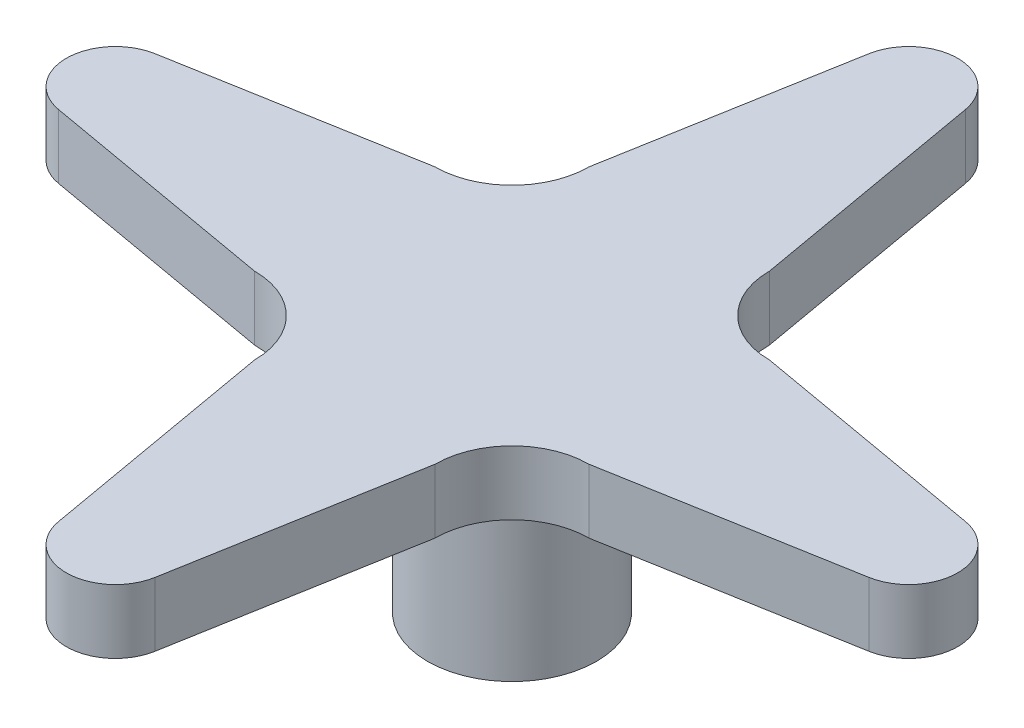
ISO-10303-21;
HEADER;
FILE_DESCRIPTION(('STEP AP214'),'2;1');
FILE_NAME('part.step','',(''),(''),'','','');
FILE_SCHEMA(('AUTOMOTIVE_DESIGN { 1 0 10303 214 1 1 1 1 }'));
ENDSEC;
DATA;
#1=APPLICATION_CONTEXT('core data for automotive mechanical design processes');
#2=APPLICATION_PROTOCOL_DEFINITION('international standard','automotive_design',2000,#1);
#3=PRODUCT_CONTEXT('',#1,'mechanical');
#4=PRODUCT('Part','Part','',(#3));
#5=PRODUCT_RELATED_PRODUCT_CATEGORY('part','',(#4));
#6=PRODUCT_DEFINITION_FORMATION('','',#4);
#7=PRODUCT_DEFINITION_CONTEXT('part definition',#1,'design');
#8=PRODUCT_DEFINITION('design','',#6,#7);
#9=PRODUCT_DEFINITION_SHAPE('','',#8);
#10=(LENGTH_UNIT() NAMED_UNIT(*) SI_UNIT(.MILLI.,.METRE.));
#11=(NAMED_UNIT(*) PLANE_ANGLE_UNIT() SI_UNIT($,.RADIAN.));
#12=(NAMED_UNIT(*) SI_UNIT($,.STERADIAN.) SOLID_ANGLE_UNIT());
#13=UNCERTAINTY_MEASURE_WITH_UNIT(LENGTH_MEASURE(1.E-05),#10,'distance_accuracy_value','');
#14=(GEOMETRIC_REPRESENTATION_CONTEXT(3) GLOBAL_UNCERTAINTY_ASSIGNED_CONTEXT((#13)) GLOBAL_UNIT_ASSIGNED_CONTEXT((#10,
#11,#12)) REPRESENTATION_CONTEXT('',''));
#15=CARTESIAN_POINT('',(0.,0.,0.));
#16=DIRECTION('',(0.,0.,1.));
#17=DIRECTION('',(1.,0.,0.));
#18=AXIS2_PLACEMENT_3D('',#15,#16,#17);
#19=CARTESIAN_POINT('',(0.,1.325,-16.4191467762285));
#20=DIRECTION('',(0.,-1.,0.));
#21=DIRECTION('',(0.,0.,-1.));
#22=AXIS2_PLACEMENT_3D('',#19,#20,#21);
#23=CYLINDRICAL_SURFACE('',#22,2.03085322377149);
#24=CARTESIAN_POINT('',(0.,-1.325,-16.4191467762285));
#25=DIRECTION('',(0.,1.,0.));
#26=DIRECTION('',(0.,0.,1.));
#27=AXIS2_PLACEMENT_3D('',#24,#25,#26);
#28=CIRCLE('',#27,2.03085322377149);
#29=CARTESIAN_POINT('',(2.,-1.325,-16.7718007376454));
#30=VERTEX_POINT('',#29);
#31=CARTESIAN_POINT('',(-2.,-1.325,-16.7718007376454));
#32=VERTEX_POINT('',#31);
#33=EDGE_CURVE('E194',#30,#32,#28,.T.);
#34=ORIENTED_EDGE('',*,*,#33,.T.);
#35=DIRECTION('',(0.,-1.,0.));
#36=VECTOR('',#35,1.);
#37=CARTESIAN_POINT('',(-2.,1.325,-16.7718007376454));
#38=LINE('',#37,#36);
#39=CARTESIAN_POINT('',(-2.,1.325,-16.7718007376454));
#40=VERTEX_POINT('',#39);
#41=EDGE_CURVE('E44',#40,#32,#38,.T.);
#42=ORIENTED_EDGE('',*,*,#41,.F.);
#43=CARTESIAN_POINT('',(0.,1.325,-16.4191467762285));
#44=DIRECTION('',(0.,1.,0.));
#45=DIRECTION('',(0.,0.,1.));
#46=AXIS2_PLACEMENT_3D('',#43,#44,#45);
#47=CIRCLE('',#46,2.03085322377149);
#48=CARTESIAN_POINT('',(2.,1.325,-16.7718007376454));
#49=VERTEX_POINT('',#48);
#50=EDGE_CURVE('E229',#49,#40,#47,.T.);
#51=ORIENTED_EDGE('',*,*,#50,.F.);
#52=DIRECTION('',(0.,-1.,0.));
#53=VECTOR('',#52,1.);
#54=CARTESIAN_POINT('',(2.,1.325,-16.7718007376454));
#55=LINE('',#54,#53);
#56=EDGE_CURVE('E190',#49,#30,#55,.T.);
#57=ORIENTED_EDGE('',*,*,#56,.T.);
#58=EDGE_LOOP('',(#34,#42,#51,#57));
#59=FACE_BOUND('',#58,.T.);
#60=ADVANCED_FACE('F37',(#59),#23,.T.);
#61=CARTESIAN_POINT('',(-2.,1.325,-16.7718007376454));
#62=DIRECTION('',(0.984807753012209,0.,0.173648177666924));
#63=DIRECTION('',(0.173648177666924,0.,-0.984807753012209));
#64=AXIS2_PLACEMENT_3D('',#61,#62,#63);
#65=PLANE('',#64);
#66=DIRECTION('',(-0.173648177666924,0.,0.984807753012209));
#67=VECTOR('',#66,1.);
#68=CARTESIAN_POINT('',(-2.,-1.325,-16.7718007376454));
#69=LINE('',#68,#67);
#70=CARTESIAN_POINT('',(-3.73648177666924,-1.325,-6.92372320752332));
#71=VERTEX_POINT('',#70);
#72=EDGE_CURVE('E197',#32,#71,#69,.T.);
#73=ORIENTED_EDGE('',*,*,#72,.T.);
#74=DIRECTION('',(0.,-1.,0.));
#75=VECTOR('',#74,1.);
#76=CARTESIAN_POINT('',(-3.73648177666924,1.325,-6.92372320752332));
#77=LINE('',#76,#75);
#78=CARTESIAN_POINT('',(-3.73648177666924,1.325,-6.92372320752332));
#79=VERTEX_POINT('',#78);
#80=EDGE_CURVE('E263',#79,#71,#77,.T.);
#81=ORIENTED_EDGE('',*,*,#80,.F.);
#82=DIRECTION('',(-0.173648177666924,0.,0.984807753012209));
#83=VECTOR('',#82,1.);
#84=CARTESIAN_POINT('',(-2.,1.325,-16.7718007376454));
#85=LINE('',#84,#83);
#86=EDGE_CURVE('E126',#40,#79,#85,.T.);
#87=ORIENTED_EDGE('',*,*,#86,.F.);
#88=ORIENTED_EDGE('',*,*,#41,.T.);
#89=EDGE_LOOP('',(#73,#81,#87,#88));
#90=FACE_BOUND('',#89,.T.);
#91=ADVANCED_FACE('F266',(#90),#65,.F.);
#92=CARTESIAN_POINT('',(-6.92372320752326,1.325,-6.9237232075234));
#93=DIRECTION('',(0.,-1.,0.));
#94=DIRECTION('',(0.,0.,-1.));
#95=AXIS2_PLACEMENT_3D('',#92,#93,#94);
#96=CYLINDRICAL_SURFACE('',#95,3.18724143085409);
#97=CARTESIAN_POINT('',(-6.92372320752326,-1.325,-6.9237232075234));
#98=DIRECTION('',(0.,-1.,0.));
#99=DIRECTION('',(0.,0.,1.));
#100=AXIS2_PLACEMENT_3D('',#97,#98,#99);
#101=CIRCLE('',#100,3.18724143085409);
#102=CARTESIAN_POINT('',(-6.92372320752328,-1.325,-3.73648177666931));
#103=VERTEX_POINT('',#102);
#104=EDGE_CURVE('E201',#71,#103,#101,.T.);
#105=ORIENTED_EDGE('',*,*,#104,.T.);
#106=DIRECTION('',(0.,-1.,0.));
#107=VECTOR('',#106,1.);
#108=CARTESIAN_POINT('',(-6.92372320752328,1.325,-3.73648177666931));
#109=LINE('',#108,#107);
#110=CARTESIAN_POINT('',(-6.92372320752328,1.325,-3.73648177666931));
#111=VERTEX_POINT('',#110);
#112=EDGE_CURVE('E260',#111,#103,#109,.T.);
#113=ORIENTED_EDGE('',*,*,#112,.F.);
#114=CARTESIAN_POINT('',(-6.92372320752333,1.325,-6.92372320752334));
#115=DIRECTION('',(0.,-1.,0.));
#116=DIRECTION('',(0.,0.,-1.));
#117=AXIS2_PLACEMENT_3D('',#114,#115,#116);
#118=CIRCLE('',#117,3.18724143085409);
#119=EDGE_CURVE('E285',#79,#111,#118,.T.);
#120=ORIENTED_EDGE('',*,*,#119,.F.);
#121=ORIENTED_EDGE('',*,*,#80,.T.);
#122=EDGE_LOOP('',(#105,#113,#120,#121));
#123=FACE_BOUND('',#122,.T.);
#124=ADVANCED_FACE('F276',(#123),#96,.F.);
#125=CARTESIAN_POINT('',(-16.7718007376454,1.325,-2.00000000000017));
#126=DIRECTION('',(0.173648177666913,0.,0.984807753012211));
#127=DIRECTION('',(0.984807753012211,0.,-0.173648177666913));
#128=AXIS2_PLACEMENT_3D('',#125,#126,#127);
#129=PLANE('',#128);
#130=DIRECTION('',(-0.984807753012211,0.,0.173648177666913));
#131=VECTOR('',#130,1.);
#132=CARTESIAN_POINT('',(-16.7718007376454,-1.325,-2.00000000000017));
#133=LINE('',#132,#131);
#134=CARTESIAN_POINT('',(-16.7718007376454,-1.325,-2.00000000000018));
#135=VERTEX_POINT('',#134);
#136=EDGE_CURVE('E203',#103,#135,#133,.T.);
#137=ORIENTED_EDGE('',*,*,#136,.T.);
#138=DIRECTION('',(0.,-1.,0.));
#139=VECTOR('',#138,1.);
#140=CARTESIAN_POINT('',(-16.7718007376454,1.325,-2.00000000000018));
#141=LINE('',#140,#139);
#142=CARTESIAN_POINT('',(-16.7718007376454,1.325,-2.00000000000018));
#143=VERTEX_POINT('',#142);
#144=EDGE_CURVE('E257',#143,#135,#141,.T.);
#145=ORIENTED_EDGE('',*,*,#144,.F.);
#146=DIRECTION('',(-0.984807753012211,0.,0.173648177666913));
#147=VECTOR('',#146,1.);
#148=CARTESIAN_POINT('',(-16.7718007376454,1.325,-2.00000000000017));
#149=LINE('',#148,#147);
#150=EDGE_CURVE('E282',#111,#143,#149,.T.);
#151=ORIENTED_EDGE('',*,*,#150,.F.);
#152=ORIENTED_EDGE('',*,*,#112,.T.);
#153=EDGE_LOOP('',(#137,#145,#151,#152));
#154=FACE_BOUND('',#153,.T.);
#155=ADVANCED_FACE('F280',(#154),#129,.F.);
#156=CARTESIAN_POINT('',(-16.4191467762285,1.325,-1.71294574661319E-13));
#157=DIRECTION('',(0.,-1.,0.));
#158=DIRECTION('',(0.,0.,-1.));
#159=AXIS2_PLACEMENT_3D('',#156,#157,#158);
#160=CYLINDRICAL_SURFACE('',#159,2.03085322377149);
#161=CARTESIAN_POINT('',(-16.4191467762285,-1.325,-1.71294574661319E-13));
#162=DIRECTION('',(0.,1.,0.));
#163=DIRECTION('',(0.,0.,1.));
#164=AXIS2_PLACEMENT_3D('',#161,#162,#163);
#165=CIRCLE('',#164,2.03085322377149);
#166=CARTESIAN_POINT('',(-16.7718007376454,-1.325,1.99999999999983));
#167=VERTEX_POINT('',#166);
#168=EDGE_CURVE('E205',#135,#167,#165,.T.);
#169=ORIENTED_EDGE('',*,*,#168,.T.);
#170=DIRECTION('',(0.,-1.,0.));
#171=VECTOR('',#170,1.);
#172=CARTESIAN_POINT('',(-16.7718007376454,1.325,1.99999999999983));
#173=LINE('',#172,#171);
#174=CARTESIAN_POINT('',(-16.7718007376454,1.325,1.99999999999983));
#175=VERTEX_POINT('',#174);
#176=EDGE_CURVE('E254',#175,#167,#173,.T.);
#177=ORIENTED_EDGE('',*,*,#176,.F.);
#178=CARTESIAN_POINT('',(-16.4191467762285,1.325,-1.71294574661319E-13));
#179=DIRECTION('',(0.,1.,0.));
#180=DIRECTION('',(0.,0.,1.));
#181=AXIS2_PLACEMENT_3D('',#178,#179,#180);
#182=CIRCLE('',#181,2.03085322377149);
#183=EDGE_CURVE('E284',#143,#175,#182,.T.);
#184=ORIENTED_EDGE('',*,*,#183,.F.);
#185=ORIENTED_EDGE('',*,*,#144,.T.);
#186=EDGE_LOOP('',(#169,#177,#184,#185));
#187=FACE_BOUND('',#186,.T.);
#188=ADVANCED_FACE('F369',(#187),#160,.T.);
#189=CARTESIAN_POINT('',(-16.7718007376454,1.325,1.99999999999983));
#190=DIRECTION('',(0.173648177666934,0.,-0.984807753012207));
#191=DIRECTION('',(-0.984807753012207,0.,-0.173648177666934));
#192=AXIS2_PLACEMENT_3D('',#189,#190,#191);
#193=PLANE('',#192);
#194=DIRECTION('',(0.984807753012207,0.,0.173648177666934));
#195=VECTOR('',#194,1.);
#196=CARTESIAN_POINT('',(-16.7718007376454,-1.325,1.99999999999983));
#197=LINE('',#196,#195);
#198=CARTESIAN_POINT('',(-6.92372320752336,-1.325,3.73648177666916));
#199=VERTEX_POINT('',#198);
#200=EDGE_CURVE('E207',#167,#199,#197,.T.);
#201=ORIENTED_EDGE('',*,*,#200,.T.);
#202=DIRECTION('',(0.,-1.,0.));
#203=VECTOR('',#202,1.);
#204=CARTESIAN_POINT('',(-6.92372320752336,1.325,3.73648177666916));
#205=LINE('',#204,#203);
#206=CARTESIAN_POINT('',(-6.92372320752336,1.325,3.73648177666916));
#207=VERTEX_POINT('',#206);
#208=EDGE_CURVE('E251',#207,#199,#205,.T.);
#209=ORIENTED_EDGE('',*,*,#208,.F.);
#210=DIRECTION('',(0.984807753012207,0.,0.173648177666934));
#211=VECTOR('',#210,1.);
#212=CARTESIAN_POINT('',(-16.7718007376454,1.325,1.99999999999983));
#213=LINE('',#212,#211);
#214=EDGE_CURVE('E287',#175,#207,#213,.T.);
#215=ORIENTED_EDGE('',*,*,#214,.F.);
#216=ORIENTED_EDGE('',*,*,#176,.T.);
#217=EDGE_LOOP('',(#201,#209,#215,#216));
#218=FACE_BOUND('',#217,.T.);
#219=ADVANCED_FACE('F372',(#218),#193,.F.);
#220=CARTESIAN_POINT('',(-6.92372320752338,1.325,6.92372320752329));
#221=DIRECTION('',(0.,-1.,0.));
#222=DIRECTION('',(0.,0.,-1.));
#223=AXIS2_PLACEMENT_3D('',#220,#221,#222);
#224=CYLINDRICAL_SURFACE('',#223,3.18724143085409);
#225=CARTESIAN_POINT('',(-6.92372320752338,-1.325,6.92372320752329));
#226=DIRECTION('',(0.,-1.,0.));
#227=DIRECTION('',(0.,0.,1.));
#228=AXIS2_PLACEMENT_3D('',#225,#226,#227);
#229=CIRCLE('',#228,3.18724143085409);
#230=CARTESIAN_POINT('',(-3.73648177666928,-1.325,6.9237232075233));
#231=VERTEX_POINT('',#230);
#232=EDGE_CURVE('E210',#199,#231,#229,.T.);
#233=ORIENTED_EDGE('',*,*,#232,.T.);
#234=DIRECTION('',(0.,-1.,0.));
#235=VECTOR('',#234,1.);
#236=CARTESIAN_POINT('',(-3.73648177666928,1.325,6.9237232075233));
#237=LINE('',#236,#235);
#238=CARTESIAN_POINT('',(-3.73648177666928,1.325,6.9237232075233));
#239=VERTEX_POINT('',#238);
#240=EDGE_CURVE('E248',#239,#231,#237,.T.);
#241=ORIENTED_EDGE('',*,*,#240,.F.);
#242=CARTESIAN_POINT('',(-6.92372320752341,1.325,6.92372320752325));
#243=DIRECTION('',(0.,-1.,0.));
#244=DIRECTION('',(0.,0.,-1.));
#245=AXIS2_PLACEMENT_3D('',#242,#243,#244);
#246=CIRCLE('',#245,3.18724143085409);
#247=EDGE_CURVE('E293',#207,#239,#246,.T.);
#248=ORIENTED_EDGE('',*,*,#247,.F.);
#249=ORIENTED_EDGE('',*,*,#208,.T.);
#250=EDGE_LOOP('',(#233,#241,#248,#249));
#251=FACE_BOUND('',#250,.T.);
#252=ADVANCED_FACE('F376',(#251),#224,.F.);
#253=CARTESIAN_POINT('',(-2.00000000000012,1.325,16.7718007376454));
#254=DIRECTION('',(0.98480775301221,0.,-0.173648177666917));
#255=DIRECTION('',(-0.173648177666917,0.,-0.98480775301221));
#256=AXIS2_PLACEMENT_3D('',#253,#254,#255);
#257=PLANE('',#256);
#258=DIRECTION('',(0.173648177666917,0.,0.98480775301221));
#259=VECTOR('',#258,1.);
#260=CARTESIAN_POINT('',(-2.00000000000012,-1.325,16.7718007376454));
#261=LINE('',#260,#259);
#262=CARTESIAN_POINT('',(-2.00000000000012,-1.325,16.7718007376454));
#263=VERTEX_POINT('',#262);
#264=EDGE_CURVE('E212',#231,#263,#261,.T.);
#265=ORIENTED_EDGE('',*,*,#264,.T.);
#266=DIRECTION('',(0.,-1.,0.));
#267=VECTOR('',#266,1.);
#268=CARTESIAN_POINT('',(-2.00000000000012,1.325,16.7718007376454));
#269=LINE('',#268,#267);
#270=CARTESIAN_POINT('',(-2.00000000000012,1.325,16.7718007376454));
#271=VERTEX_POINT('',#270);
#272=EDGE_CURVE('E245',#271,#263,#269,.T.);
#273=ORIENTED_EDGE('',*,*,#272,.F.);
#274=DIRECTION('',(0.173648177666917,0.,0.98480775301221));
#275=VECTOR('',#274,1.);
#276=CARTESIAN_POINT('',(-2.00000000000012,1.325,16.7718007376454));
#277=LINE('',#276,#275);
#278=EDGE_CURVE('E295',#239,#271,#277,.T.);
#279=ORIENTED_EDGE('',*,*,#278,.F.);
#280=ORIENTED_EDGE('',*,*,#240,.T.);
#281=EDGE_LOOP('',(#265,#273,#279,#280));
#282=FACE_BOUND('',#281,.T.);
#283=ADVANCED_FACE('F380',(#282),#257,.F.);
#284=CARTESIAN_POINT('',(-1.14654289137856E-13,1.325,16.4191467762285));
#285=DIRECTION('',(0.,-1.,0.));
#286=DIRECTION('',(0.,0.,-1.));
#287=AXIS2_PLACEMENT_3D('',#284,#285,#286);
#288=CYLINDRICAL_SURFACE('',#287,2.03085322377149);
#289=CARTESIAN_POINT('',(-1.14654289137856E-13,-1.325,16.4191467762285));
#290=DIRECTION('',(0.,1.,0.));
#291=DIRECTION('',(0.,0.,1.));
#292=AXIS2_PLACEMENT_3D('',#289,#290,#291);
#293=CIRCLE('',#292,2.03085322377149);
#294=CARTESIAN_POINT('',(1.99999999999988,-1.325,16.7718007376454));
#295=VERTEX_POINT('',#294);
#296=EDGE_CURVE('E214',#263,#295,#293,.T.);
#297=ORIENTED_EDGE('',*,*,#296,.T.);
#298=DIRECTION('',(0.,-1.,0.));
#299=VECTOR('',#298,1.);
#300=CARTESIAN_POINT('',(1.99999999999988,1.325,16.7718007376454));
#301=LINE('',#300,#299);
#302=CARTESIAN_POINT('',(1.99999999999988,1.325,16.7718007376454));
#303=VERTEX_POINT('',#302);
#304=EDGE_CURVE('E242',#303,#295,#301,.T.);
#305=ORIENTED_EDGE('',*,*,#304,.F.);
#306=CARTESIAN_POINT('',(-1.14654289137856E-13,1.325,16.4191467762285));
#307=DIRECTION('',(0.,1.,0.));
#308=DIRECTION('',(0.,0.,1.));
#309=AXIS2_PLACEMENT_3D('',#306,#307,#308);
#310=CIRCLE('',#309,2.03085322377149);
#311=EDGE_CURVE('E297',#271,#303,#310,.T.);
#312=ORIENTED_EDGE('',*,*,#311,.F.);
#313=ORIENTED_EDGE('',*,*,#272,.T.);
#314=EDGE_LOOP('',(#297,#305,#312,#313));
#315=FACE_BOUND('',#314,.T.);
#316=ADVANCED_FACE('F384',(#315),#288,.T.);
#317=CARTESIAN_POINT('',(1.99999999999988,1.325,16.7718007376454));
#318=DIRECTION('',(-0.984807753012208,0.,-0.173648177666931));
#319=DIRECTION('',(-0.173648177666931,0.,0.984807753012208));
#320=AXIS2_PLACEMENT_3D('',#317,#318,#319);
#321=PLANE('',#320);
#322=DIRECTION('',(0.173648177666931,0.,-0.984807753012208));
#323=VECTOR('',#322,1.);
#324=CARTESIAN_POINT('',(1.99999999999988,-1.325,16.7718007376454));
#325=LINE('',#324,#323);
#326=CARTESIAN_POINT('',(3.73648177666919,-1.325,6.92372320752335));
#327=VERTEX_POINT('',#326);
#328=EDGE_CURVE('E216',#295,#327,#325,.T.);
#329=ORIENTED_EDGE('',*,*,#328,.T.);
#330=DIRECTION('',(0.,-1.,0.));
#331=VECTOR('',#330,1.);
#332=CARTESIAN_POINT('',(3.73648177666919,1.325,6.92372320752335));
#333=LINE('',#332,#331);
#334=CARTESIAN_POINT('',(3.73648177666919,1.325,6.92372320752335));
#335=VERTEX_POINT('',#334);
#336=EDGE_CURVE('E239',#335,#327,#333,.T.);
#337=ORIENTED_EDGE('',*,*,#336,.F.);
#338=DIRECTION('',(0.173648177666931,0.,-0.984807753012208));
#339=VECTOR('',#338,1.);
#340=CARTESIAN_POINT('',(1.99999999999988,1.325,16.7718007376454));
#341=LINE('',#340,#339);
#342=EDGE_CURVE('E299',#303,#335,#341,.T.);
#343=ORIENTED_EDGE('',*,*,#342,.F.);
#344=ORIENTED_EDGE('',*,*,#304,.T.);
#345=EDGE_LOOP('',(#329,#337,#343,#344));
#346=FACE_BOUND('',#345,.T.);
#347=ADVANCED_FACE('F388',(#346),#321,.F.);
#348=CARTESIAN_POINT('',(6.92372320752331,1.325,6.92372320752335));
#349=DIRECTION('',(0.,-1.,0.));
#350=DIRECTION('',(0.,0.,-1.));
#351=AXIS2_PLACEMENT_3D('',#348,#349,#350);
#352=CYLINDRICAL_SURFACE('',#351,3.18724143085409);
#353=CARTESIAN_POINT('',(6.92372320752331,-1.325,6.92372320752335));
#354=DIRECTION('',(0.,-1.,0.));
#355=DIRECTION('',(0.,0.,1.));
#356=AXIS2_PLACEMENT_3D('',#353,#354,#355);
#357=CIRCLE('',#356,3.18724143085409);
#358=CARTESIAN_POINT('',(6.92372320752331,-1.325,3.73648177666926));
#359=VERTEX_POINT('',#358);
#360=EDGE_CURVE('E219',#327,#359,#357,.T.);
#361=ORIENTED_EDGE('',*,*,#360,.T.);
#362=DIRECTION('',(0.,-1.,0.));
#363=VECTOR('',#362,1.);
#364=CARTESIAN_POINT('',(6.92372320752331,1.325,3.73648177666926));
#365=LINE('',#364,#363);
#366=CARTESIAN_POINT('',(6.92372320752331,1.325,3.73648177666926));
#367=VERTEX_POINT('',#366);
#368=EDGE_CURVE('E236',#367,#359,#365,.T.);
#369=ORIENTED_EDGE('',*,*,#368,.F.);
#370=CARTESIAN_POINT('',(6.92372320752328,1.325,6.92372320752338));
#371=DIRECTION('',(0.,-1.,0.));
#372=DIRECTION('',(0.,0.,-1.));
#373=AXIS2_PLACEMENT_3D('',#370,#371,#372);
#374=CIRCLE('',#373,3.18724143085409);
#375=EDGE_CURVE('E301',#335,#367,#374,.T.);
#376=ORIENTED_EDGE('',*,*,#375,.F.);
#377=ORIENTED_EDGE('',*,*,#336,.T.);
#378=EDGE_LOOP('',(#361,#369,#376,#377));
#379=FACE_BOUND('',#378,.T.);
#380=ADVANCED_FACE('F392',(#379),#352,.F.);
#381=CARTESIAN_POINT('',(16.7718007376454,1.325,2.00000000000006));
#382=DIRECTION('',(-0.17364817766692,0.,-0.98480775301221));
#383=DIRECTION('',(-0.98480775301221,0.,0.17364817766692));
#384=AXIS2_PLACEMENT_3D('',#381,#382,#383);
#385=PLANE('',#384);
#386=DIRECTION('',(0.98480775301221,0.,-0.17364817766692));
#387=VECTOR('',#386,1.);
#388=CARTESIAN_POINT('',(16.7718007376454,-1.325,2.00000000000006));
#389=LINE('',#388,#387);
#390=CARTESIAN_POINT('',(16.7718007376454,-1.325,2.00000000000006));
#391=VERTEX_POINT('',#390);
#392=EDGE_CURVE('E221',#359,#391,#389,.T.);
#393=ORIENTED_EDGE('',*,*,#392,.T.);
#394=DIRECTION('',(0.,-1.,0.));
#395=VECTOR('',#394,1.);
#396=CARTESIAN_POINT('',(16.7718007376454,1.325,2.00000000000006));
#397=LINE('',#396,#395);
#398=CARTESIAN_POINT('',(16.7718007376454,1.325,2.00000000000006));
#399=VERTEX_POINT('',#398);
#400=EDGE_CURVE('E233',#399,#391,#397,.T.);
#401=ORIENTED_EDGE('',*,*,#400,.F.);
#402=DIRECTION('',(0.98480775301221,0.,-0.17364817766692));
#403=VECTOR('',#402,1.);
#404=CARTESIAN_POINT('',(16.7718007376454,1.325,2.00000000000006));
#405=LINE('',#404,#403);
#406=EDGE_CURVE('E303',#367,#399,#405,.T.);
#407=ORIENTED_EDGE('',*,*,#406,.F.);
#408=ORIENTED_EDGE('',*,*,#368,.T.);
#409=EDGE_LOOP('',(#393,#401,#407,#408));
#410=FACE_BOUND('',#409,.T.);
#411=ADVANCED_FACE('F309',(#410),#385,.F.);
#412=CARTESIAN_POINT('',(16.4191467762285,1.325,0.));
#413=DIRECTION('',(0.,-1.,0.));
#414=DIRECTION('',(0.,0.,-1.));
#415=AXIS2_PLACEMENT_3D('',#412,#413,#414);
#416=CYLINDRICAL_SURFACE('',#415,2.03085322377149);
#417=CARTESIAN_POINT('',(16.4191467762285,-1.325,0.));
#418=DIRECTION('',(0.,1.,0.));
#419=DIRECTION('',(0.,0.,1.));
#420=AXIS2_PLACEMENT_3D('',#417,#418,#419);
#421=CIRCLE('',#420,2.03085322377149);
#422=CARTESIAN_POINT('',(16.7718007376454,-1.325,-1.99999999999994));
#423=VERTEX_POINT('',#422);
#424=EDGE_CURVE('E223',#391,#423,#421,.T.);
#425=ORIENTED_EDGE('',*,*,#424,.T.);
#426=DIRECTION('',(0.,-1.,0.));
#427=VECTOR('',#426,1.);
#428=CARTESIAN_POINT('',(16.7718007376454,1.325,-1.99999999999994));
#429=LINE('',#428,#427);
#430=CARTESIAN_POINT('',(16.7718007376454,1.325,-1.99999999999994));
#431=VERTEX_POINT('',#430);
#432=EDGE_CURVE('E185',#431,#423,#429,.T.);
#433=ORIENTED_EDGE('',*,*,#432,.F.);
#434=CARTESIAN_POINT('',(16.4191467762285,1.325,0.));
#435=DIRECTION('',(0.,1.,0.));
#436=DIRECTION('',(0.,0.,1.));
#437=AXIS2_PLACEMENT_3D('',#434,#435,#436);
#438=CIRCLE('',#437,2.03085322377149);
#439=EDGE_CURVE('E173',#399,#431,#438,.T.);
#440=ORIENTED_EDGE('',*,*,#439,.F.);
#441=ORIENTED_EDGE('',*,*,#400,.T.);
#442=EDGE_LOOP('',(#425,#433,#440,#441));
#443=FACE_BOUND('',#442,.T.);
#444=ADVANCED_FACE('F313',(#443),#416,.T.);
#445=CARTESIAN_POINT('',(16.7718007376454,1.325,-1.99999999999994));
#446=DIRECTION('',(-0.173648177666927,0.,0.984807753012209));
#447=DIRECTION('',(0.984807753012209,0.,0.173648177666927));
#448=AXIS2_PLACEMENT_3D('',#445,#446,#447);
#449=PLANE('',#448);
#450=DIRECTION('',(-0.984807753012209,0.,-0.173648177666927));
#451=VECTOR('',#450,1.);
#452=CARTESIAN_POINT('',(16.7718007376454,-1.325,-1.99999999999994));
#453=LINE('',#452,#451);
#454=CARTESIAN_POINT('',(6.92372320752334,-1.325,-3.73648177666921));
#455=VERTEX_POINT('',#454);
#456=EDGE_CURVE('E183',#423,#455,#453,.T.);
#457=ORIENTED_EDGE('',*,*,#456,.T.);
#458=DIRECTION('',(0.,-1.,0.));
#459=VECTOR('',#458,1.);
#460=CARTESIAN_POINT('',(6.92372320752334,1.325,-3.73648177666921));
#461=LINE('',#460,#459);
#462=CARTESIAN_POINT('',(6.92372320752334,1.325,-3.73648177666921));
#463=VERTEX_POINT('',#462);
#464=EDGE_CURVE('E180',#463,#455,#461,.T.);
#465=ORIENTED_EDGE('',*,*,#464,.F.);
#466=DIRECTION('',(-0.984807753012209,0.,-0.173648177666927));
#467=VECTOR('',#466,1.);
#468=CARTESIAN_POINT('',(16.7718007376454,1.325,-1.99999999999994));
#469=LINE('',#468,#467);
#470=EDGE_CURVE('E166',#431,#463,#469,.T.);
#471=ORIENTED_EDGE('',*,*,#470,.F.);
#472=ORIENTED_EDGE('',*,*,#432,.T.);
#473=EDGE_LOOP('',(#457,#465,#471,#472));
#474=FACE_BOUND('',#473,.T.);
#475=ADVANCED_FACE('F181',(#474),#449,.F.);
#476=CARTESIAN_POINT('',(6.92372320752333,1.325,-6.92372320752334));
#477=DIRECTION('',(0.,-1.,0.));
#478=DIRECTION('',(0.,0.,-1.));
#479=AXIS2_PLACEMENT_3D('',#476,#477,#478);
#480=CYLINDRICAL_SURFACE('',#479,3.18724143085409);
#481=CARTESIAN_POINT('',(6.92372320752333,-1.325,-6.92372320752334));
#482=DIRECTION('',(0.,-1.,0.));
#483=DIRECTION('',(0.,0.,1.));
#484=AXIS2_PLACEMENT_3D('',#481,#482,#483);
#485=CIRCLE('',#484,3.18724143085409);
#486=CARTESIAN_POINT('',(3.73648177666924,-1.325,-6.92372320752332));
#487=VERTEX_POINT('',#486);
#488=EDGE_CURVE('E226',#455,#487,#485,.T.);
#489=ORIENTED_EDGE('',*,*,#488,.T.);
#490=DIRECTION('',(0.,-1.,0.));
#491=VECTOR('',#490,1.);
#492=CARTESIAN_POINT('',(3.73648177666924,1.325,-6.92372320752332));
#493=LINE('',#492,#491);
#494=CARTESIAN_POINT('',(3.73648177666924,1.325,-6.92372320752332));
#495=VERTEX_POINT('',#494);
#496=EDGE_CURVE('E186',#495,#487,#493,.T.);
#497=ORIENTED_EDGE('',*,*,#496,.F.);
#498=CARTESIAN_POINT('',(6.92372320752336,1.325,-6.9237232075233));
#499=DIRECTION('',(0.,-1.,0.));
#500=DIRECTION('',(0.,0.,-1.));
#501=AXIS2_PLACEMENT_3D('',#498,#499,#500);
#502=CIRCLE('',#501,3.18724143085409);
#503=EDGE_CURVE('E170',#463,#495,#502,.T.);
#504=ORIENTED_EDGE('',*,*,#503,.F.);
#505=ORIENTED_EDGE('',*,*,#464,.T.);
#506=EDGE_LOOP('',(#489,#497,#504,#505));
#507=FACE_BOUND('',#506,.T.);
#508=ADVANCED_FACE('F188',(#507),#480,.F.);
#509=CARTESIAN_POINT('',(2.,1.325,-16.7718007376454));
#510=DIRECTION('',(-0.984807753012209,0.,0.173648177666924));
#511=DIRECTION('',(0.173648177666924,0.,0.984807753012209));
#512=AXIS2_PLACEMENT_3D('',#509,#510,#511);
#513=PLANE('',#512);
#514=DIRECTION('',(-0.173648177666924,0.,-0.984807753012209));
#515=VECTOR('',#514,1.);
#516=CARTESIAN_POINT('',(2.,-1.325,-16.7718007376454));
#517=LINE('',#516,#515);
#518=EDGE_CURVE('E117',#487,#30,#517,.T.);
#519=ORIENTED_EDGE('',*,*,#518,.T.);
#520=ORIENTED_EDGE('',*,*,#56,.F.);
#521=DIRECTION('',(-0.173648177666924,0.,-0.984807753012209));
#522=VECTOR('',#521,1.);
#523=CARTESIAN_POINT('',(2.,1.325,-16.7718007376454));
#524=LINE('',#523,#522);
#525=EDGE_CURVE('E60',#495,#49,#524,.T.);
#526=ORIENTED_EDGE('',*,*,#525,.F.);
#527=ORIENTED_EDGE('',*,*,#496,.T.);
#528=EDGE_LOOP('',(#519,#520,#526,#527));
#529=FACE_BOUND('',#528,.T.);
#530=ADVANCED_FACE('F314',(#529),#513,.F.);
#531=CARTESIAN_POINT('',(0.,1.325,-16.4191467762285));
#532=DIRECTION('',(0.,1.,0.));
#533=DIRECTION('',(0.,0.,1.));
#534=AXIS2_PLACEMENT_3D('',#531,#532,#533);
#535=PLANE('',#534);
#536=ORIENTED_EDGE('',*,*,#50,.T.);
#537=ORIENTED_EDGE('',*,*,#86,.T.);
#538=ORIENTED_EDGE('',*,*,#119,.T.);
#539=ORIENTED_EDGE('',*,*,#150,.T.);
#540=ORIENTED_EDGE('',*,*,#183,.T.);
#541=ORIENTED_EDGE('',*,*,#214,.T.);
#542=ORIENTED_EDGE('',*,*,#247,.T.);
#543=ORIENTED_EDGE('',*,*,#278,.T.);
#544=ORIENTED_EDGE('',*,*,#311,.T.);
#545=ORIENTED_EDGE('',*,*,#342,.T.);
#546=ORIENTED_EDGE('',*,*,#375,.T.);
#547=ORIENTED_EDGE('',*,*,#406,.T.);
#548=ORIENTED_EDGE('',*,*,#439,.T.);
#549=ORIENTED_EDGE('',*,*,#470,.T.);
#550=ORIENTED_EDGE('',*,*,#503,.T.);
#551=ORIENTED_EDGE('',*,*,#525,.T.);
#552=EDGE_LOOP('',(#536,#537,#538,#539,#540,#541,#542,#543,#544,#545,#546,#547,#548,#549,#550,#551));
#553=FACE_BOUND('',#552,.T.);
#554=ADVANCED_FACE('F168',(#553),#535,.T.);
#555=CARTESIAN_POINT('',(0.,-1.325,-16.4191467762285));
#556=DIRECTION('',(0.,1.,0.));
#557=DIRECTION('',(0.,0.,1.));
#558=AXIS2_PLACEMENT_3D('',#555,#556,#557);
#559=PLANE('',#558);
#560=CARTESIAN_POINT('',(0.,-1.325,0.));
#561=DIRECTION('',(0.,1.,0.));
#562=DIRECTION('',(0.,0.,1.));
#563=AXIS2_PLACEMENT_3D('',#560,#561,#562);
#564=CIRCLE('',#563,3.5);
#565=CARTESIAN_POINT('',(0.,-1.325,3.5));
#566=VERTEX_POINT('',#565);
#567=EDGE_CURVE('E11',#566,#566,#564,.F.);
#568=ORIENTED_EDGE('',*,*,#567,.F.);
#569=EDGE_LOOP('',(#568));
#570=FACE_BOUND('',#569,.T.);
#571=ORIENTED_EDGE('',*,*,#33,.F.);
#572=ORIENTED_EDGE('',*,*,#518,.F.);
#573=ORIENTED_EDGE('',*,*,#488,.F.);
#574=ORIENTED_EDGE('',*,*,#456,.F.);
#575=ORIENTED_EDGE('',*,*,#424,.F.);
#576=ORIENTED_EDGE('',*,*,#392,.F.);
#577=ORIENTED_EDGE('',*,*,#360,.F.);
#578=ORIENTED_EDGE('',*,*,#328,.F.);
#579=ORIENTED_EDGE('',*,*,#296,.F.);
#580=ORIENTED_EDGE('',*,*,#264,.F.);
#581=ORIENTED_EDGE('',*,*,#232,.F.);
#582=ORIENTED_EDGE('',*,*,#200,.F.);
#583=ORIENTED_EDGE('',*,*,#168,.F.);
#584=ORIENTED_EDGE('',*,*,#136,.F.);
#585=ORIENTED_EDGE('',*,*,#104,.F.);
#586=ORIENTED_EDGE('',*,*,#72,.F.);
#587=EDGE_LOOP('',(#571,#572,#573,#574,#575,#576,#577,#578,#579,#580,#581,#582,#583,#584,#585,#586));
#588=FACE_BOUND('',#587,.T.);
#589=ADVANCED_FACE('F271',(#570,#588),#559,.F.);
#590=CARTESIAN_POINT('',(0.,-9.325,0.));
#591=DIRECTION('',(0.,1.,0.));
#592=DIRECTION('',(0.,0.,1.));
#593=AXIS2_PLACEMENT_3D('',#590,#591,#592);
#594=CYLINDRICAL_SURFACE('',#593,3.5);
#595=CARTESIAN_POINT('',(0.,-9.325,0.));
#596=DIRECTION('',(0.,-1.,0.));
#597=DIRECTION('',(0.,0.,-1.));
#598=AXIS2_PLACEMENT_3D('',#595,#596,#597);
#599=CIRCLE('',#598,3.5);
#600=CARTESIAN_POINT('',(0.,-9.325,-3.5));
#601=VERTEX_POINT('',#600);
#602=EDGE_CURVE('E198',#601,#601,#599,.T.);
#603=ORIENTED_EDGE('',*,*,#602,.F.);
#604=EDGE_LOOP('',(#603));
#605=FACE_BOUND('',#604,.T.);
#606=ORIENTED_EDGE('',*,*,#567,.T.);
#607=EDGE_LOOP('',(#606));
#608=FACE_BOUND('',#607,.T.);
#609=ADVANCED_FACE('F342',(#605,#608),#594,.T.);
#610=CARTESIAN_POINT('',(0.,-9.325,0.));
#611=DIRECTION('',(0.,-1.,0.));
#612=DIRECTION('',(0.,0.,-1.));
#613=AXIS2_PLACEMENT_3D('',#610,#611,#612);
#614=PLANE('',#613);
#615=CARTESIAN_POINT('',(0.,-9.325,0.));
#616=DIRECTION('',(0.,-1.,0.));
#617=DIRECTION('',(0.,0.,-1.));
#618=AXIS2_PLACEMENT_3D('',#615,#616,#617);
#619=CIRCLE('',#618,2.075);
#620=CARTESIAN_POINT('',(1.45945195193264,-9.325,-1.475));
#621=VERTEX_POINT('',#620);
#622=CARTESIAN_POINT('',(-1.45945195193264,-9.325,-1.475));
#623=VERTEX_POINT('',#622);
#624=EDGE_CURVE('E51',#621,#623,#619,.T.);
#625=ORIENTED_EDGE('',*,*,#624,.F.);
#626=DIRECTION('',(1.,0.,0.));
#627=VECTOR('',#626,1.);
#628=CARTESIAN_POINT('',(0.,-9.325,-1.475));
#629=LINE('',#628,#627);
#630=EDGE_CURVE('E329',#623,#621,#629,.T.);
#631=ORIENTED_EDGE('',*,*,#630,.F.);
#632=EDGE_LOOP('',(#625,#631));
#633=FACE_BOUND('',#632,.T.);
#634=ORIENTED_EDGE('',*,*,#602,.T.);
#635=EDGE_LOOP('',(#634));
#636=FACE_BOUND('',#635,.T.);
#637=ADVANCED_FACE('F338',(#633,#636),#614,.T.);
#638=CARTESIAN_POINT('',(0.,-1.325,-16.4191467762285));
#639=DIRECTION('',(0.,1.,0.));
#640=DIRECTION('',(0.,0.,1.));
#641=AXIS2_PLACEMENT_3D('',#638,#639,#640);
#642=PLANE('',#641);
#643=DIRECTION('',(1.,0.,0.));
#644=VECTOR('',#643,1.);
#645=CARTESIAN_POINT('',(0.,-1.325,-1.475));
#646=LINE('',#645,#644);
#647=CARTESIAN_POINT('',(-1.45945195193264,-1.325,-1.475));
#648=VERTEX_POINT('',#647);
#649=CARTESIAN_POINT('',(1.45945195193264,-1.325,-1.475));
#650=VERTEX_POINT('',#649);
#651=EDGE_CURVE('E321',#648,#650,#646,.T.);
#652=ORIENTED_EDGE('',*,*,#651,.T.);
#653=CARTESIAN_POINT('',(0.,-1.325,0.));
#654=DIRECTION('',(0.,1.,0.));
#655=DIRECTION('',(0.,0.,1.));
#656=AXIS2_PLACEMENT_3D('',#653,#654,#655);
#657=CIRCLE('',#656,2.075);
#658=EDGE_CURVE('E324',#650,#648,#657,.F.);
#659=ORIENTED_EDGE('',*,*,#658,.T.);
#660=EDGE_LOOP('',(#652,#659));
#661=FACE_BOUND('',#660,.T.);
#662=ADVANCED_FACE('F341',(#661),#642,.F.);
#663=CARTESIAN_POINT('',(0.,4.13622696836526,0.));
#664=DIRECTION('',(0.,-1.,0.));
#665=DIRECTION('',(0.,0.,-1.));
#666=AXIS2_PLACEMENT_3D('',#663,#664,#665);
#667=CYLINDRICAL_SURFACE('',#666,2.075);
#668=DIRECTION('',(0.,-1.,0.));
#669=VECTOR('',#668,1.);
#670=CARTESIAN_POINT('',(1.45945195193264,4.13622696836526,-1.475));
#671=LINE('',#670,#669);
#672=EDGE_CURVE('E319',#650,#621,#671,.T.);
#673=ORIENTED_EDGE('',*,*,#672,.T.);
#674=ORIENTED_EDGE('',*,*,#624,.T.);
#675=DIRECTION('',(0.,-1.,0.));
#676=VECTOR('',#675,1.);
#677=CARTESIAN_POINT('',(-1.45945195193264,4.13622696836526,-1.475));
#678=LINE('',#677,#676);
#679=EDGE_CURVE('E322',#648,#623,#678,.T.);
#680=ORIENTED_EDGE('',*,*,#679,.F.);
#681=ORIENTED_EDGE('',*,*,#658,.F.);
#682=EDGE_LOOP('',(#673,#674,#680,#681));
#683=FACE_BOUND('',#682,.T.);
#684=ADVANCED_FACE('F440',(#683),#667,.F.);
#685=CARTESIAN_POINT('',(0.,4.13622696836526,-1.475));
#686=DIRECTION('',(0.,0.,-1.));
#687=DIRECTION('',(-1.,0.,0.));
#688=AXIS2_PLACEMENT_3D('',#685,#686,#687);
#689=PLANE('',#688);
#690=ORIENTED_EDGE('',*,*,#679,.T.);
#691=ORIENTED_EDGE('',*,*,#630,.T.);
#692=ORIENTED_EDGE('',*,*,#672,.F.);
#693=ORIENTED_EDGE('',*,*,#651,.F.);
#694=EDGE_LOOP('',(#690,#691,#692,#693));
#695=FACE_BOUND('',#694,.T.);
#696=ADVANCED_FACE('F335',(#695),#689,.F.);
#697=CLOSED_SHELL('',(#60,#91,#124,#155,#188,#219,#252,#283,#316,#347,#380,#411,#444,#475,#508,
#530,#554,#589,#609,#637,#662,#684,#696));
#698=MANIFOLD_SOLID_BREP('B2',#697);
#699=ADVANCED_BREP_SHAPE_REPRESENTATION('',(#18,#698),#14);
#700=SHAPE_DEFINITION_REPRESENTATION(#9,#699);
ENDSEC;
END-ISO-10303-21;
